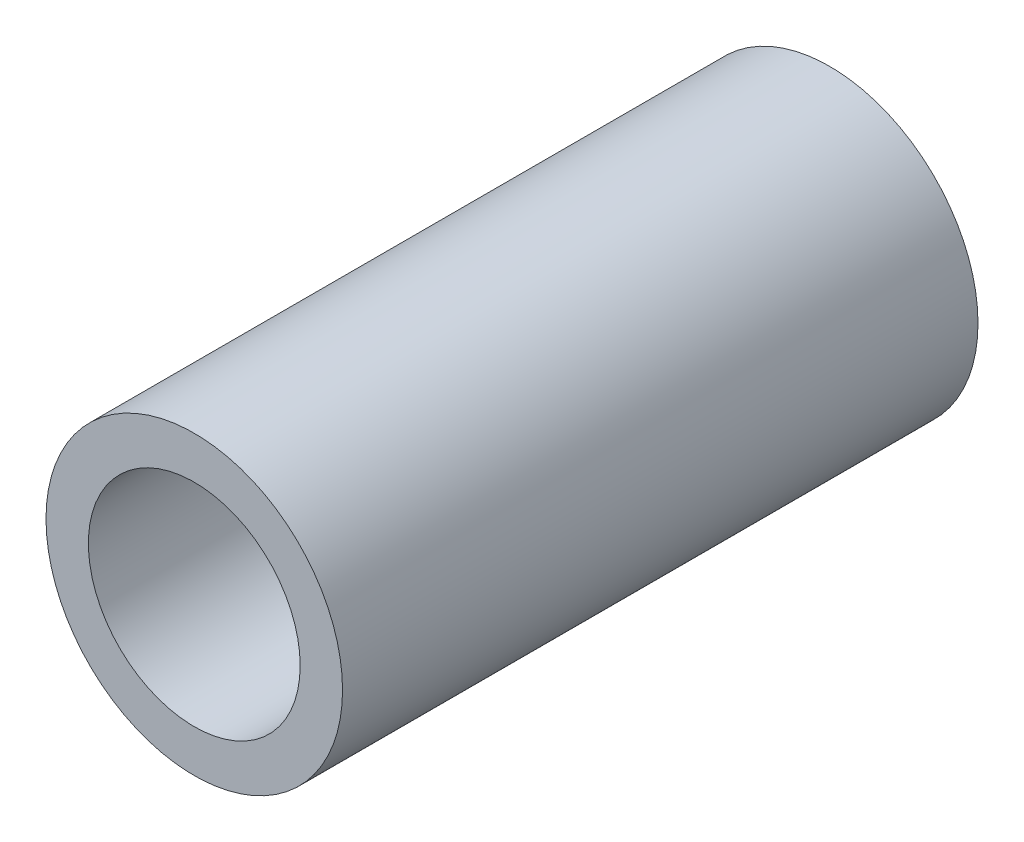
ISO-10303-21;
HEADER;
FILE_DESCRIPTION(('STEP AP214'),'2;1');
FILE_NAME('part.step','',(''),(''),'','','');
FILE_SCHEMA(('AUTOMOTIVE_DESIGN { 1 0 10303 214 1 1 1 1 }'));
ENDSEC;
DATA;
#1=APPLICATION_CONTEXT('core data for automotive mechanical design processes');
#2=APPLICATION_PROTOCOL_DEFINITION('international standard','automotive_design',2000,#1);
#3=PRODUCT_CONTEXT('',#1,'mechanical');
#4=PRODUCT('Part','Part','',(#3));
#5=PRODUCT_RELATED_PRODUCT_CATEGORY('part','',(#4));
#6=PRODUCT_DEFINITION_FORMATION('','',#4);
#7=PRODUCT_DEFINITION_CONTEXT('part definition',#1,'design');
#8=PRODUCT_DEFINITION('design','',#6,#7);
#9=PRODUCT_DEFINITION_SHAPE('','',#8);
#10=(LENGTH_UNIT() NAMED_UNIT(*) SI_UNIT(.MILLI.,.METRE.));
#11=(NAMED_UNIT(*) PLANE_ANGLE_UNIT() SI_UNIT($,.RADIAN.));
#12=(NAMED_UNIT(*) SI_UNIT($,.STERADIAN.) SOLID_ANGLE_UNIT());
#13=UNCERTAINTY_MEASURE_WITH_UNIT(LENGTH_MEASURE(1.E-05),#10,'distance_accuracy_value','');
#14=(GEOMETRIC_REPRESENTATION_CONTEXT(3) GLOBAL_UNCERTAINTY_ASSIGNED_CONTEXT((#13)) GLOBAL_UNIT_ASSIGNED_CONTEXT((#10,
#11,#12)) REPRESENTATION_CONTEXT('',''));
#15=CARTESIAN_POINT('',(0.,0.,0.));
#16=DIRECTION('',(0.,0.,1.));
#17=DIRECTION('',(1.,0.,0.));
#18=AXIS2_PLACEMENT_3D('',#15,#16,#17);
#19=CARTESIAN_POINT('',(0.,0.,30.));
#20=DIRECTION('',(0.,0.,1.));
#21=DIRECTION('',(1.,0.,0.));
#22=AXIS2_PLACEMENT_3D('',#19,#20,#21);
#23=PLANE('',#22);
#24=CARTESIAN_POINT('',(0.,0.,30.));
#25=DIRECTION('',(0.,0.,1.));
#26=DIRECTION('',(1.,0.,0.));
#27=AXIS2_PLACEMENT_3D('',#24,#25,#26);
#28=CIRCLE('',#27,7.);
#29=CARTESIAN_POINT('',(7.,0.,30.));
#30=VERTEX_POINT('',#29);
#31=EDGE_CURVE('E11',#30,#30,#28,.T.);
#32=ORIENTED_EDGE('',*,*,#31,.T.);
#33=EDGE_LOOP('',(#32));
#34=FACE_BOUND('',#33,.T.);
#35=CARTESIAN_POINT('',(0.,0.,30.));
#36=DIRECTION('',(0.,0.,1.));
#37=DIRECTION('',(1.,0.,0.));
#38=AXIS2_PLACEMENT_3D('',#35,#36,#37);
#39=CIRCLE('',#38,5.);
#40=CARTESIAN_POINT('',(5.,0.,30.));
#41=VERTEX_POINT('',#40);
#42=EDGE_CURVE('E49',#41,#41,#39,.T.);
#43=ORIENTED_EDGE('',*,*,#42,.F.);
#44=EDGE_LOOP('',(#43));
#45=FACE_BOUND('',#44,.T.);
#46=ADVANCED_FACE('F38',(#34,#45),#23,.T.);
#47=CARTESIAN_POINT('',(0.,0.,0.));
#48=DIRECTION('',(0.,0.,1.));
#49=DIRECTION('',(1.,0.,0.));
#50=AXIS2_PLACEMENT_3D('',#47,#48,#49);
#51=PLANE('',#50);
#52=CARTESIAN_POINT('',(0.,0.,0.));
#53=DIRECTION('',(0.,0.,1.));
#54=DIRECTION('',(1.,0.,0.));
#55=AXIS2_PLACEMENT_3D('',#52,#53,#54);
#56=CIRCLE('',#55,7.);
#57=CARTESIAN_POINT('',(7.,0.,0.));
#58=VERTEX_POINT('',#57);
#59=EDGE_CURVE('E42',#58,#58,#56,.T.);
#60=ORIENTED_EDGE('',*,*,#59,.F.);
#61=EDGE_LOOP('',(#60));
#62=FACE_BOUND('',#61,.T.);
#63=CARTESIAN_POINT('',(0.,0.,0.));
#64=DIRECTION('',(0.,0.,1.));
#65=DIRECTION('',(1.,0.,0.));
#66=AXIS2_PLACEMENT_3D('',#63,#64,#65);
#67=CIRCLE('',#66,5.);
#68=CARTESIAN_POINT('',(5.,0.,0.));
#69=VERTEX_POINT('',#68);
#70=EDGE_CURVE('E51',#69,#69,#67,.T.);
#71=ORIENTED_EDGE('',*,*,#70,.T.);
#72=EDGE_LOOP('',(#71));
#73=FACE_BOUND('',#72,.T.);
#74=ADVANCED_FACE('F61',(#62,#73),#51,.F.);
#75=CARTESIAN_POINT('',(0.,0.,30.));
#76=DIRECTION('',(0.,0.,-1.));
#77=DIRECTION('',(-1.,0.,0.));
#78=AXIS2_PLACEMENT_3D('',#75,#76,#77);
#79=CYLINDRICAL_SURFACE('',#78,7.);
#80=ORIENTED_EDGE('',*,*,#31,.F.);
#81=EDGE_LOOP('',(#80));
#82=FACE_BOUND('',#81,.T.);
#83=ORIENTED_EDGE('',*,*,#59,.T.);
#84=EDGE_LOOP('',(#83));
#85=FACE_BOUND('',#84,.T.);
#86=ADVANCED_FACE('F40',(#82,#85),#79,.T.);
#87=CARTESIAN_POINT('',(0.,0.,30.));
#88=DIRECTION('',(0.,0.,-1.));
#89=DIRECTION('',(-1.,0.,0.));
#90=AXIS2_PLACEMENT_3D('',#87,#88,#89);
#91=CYLINDRICAL_SURFACE('',#90,5.);
#92=ORIENTED_EDGE('',*,*,#42,.T.);
#93=EDGE_LOOP('',(#92));
#94=FACE_BOUND('',#93,.T.);
#95=ORIENTED_EDGE('',*,*,#70,.F.);
#96=EDGE_LOOP('',(#95));
#97=FACE_BOUND('',#96,.T.);
#98=ADVANCED_FACE('F57',(#94,#97),#91,.F.);
#99=CLOSED_SHELL('',(#46,#74,#86,#98));
#100=MANIFOLD_SOLID_BREP('B2',#99);
#101=ADVANCED_BREP_SHAPE_REPRESENTATION('',(#18,#100),#14);
#102=SHAPE_DEFINITION_REPRESENTATION(#9,#101);
ENDSEC;
END-ISO-10303-21;
